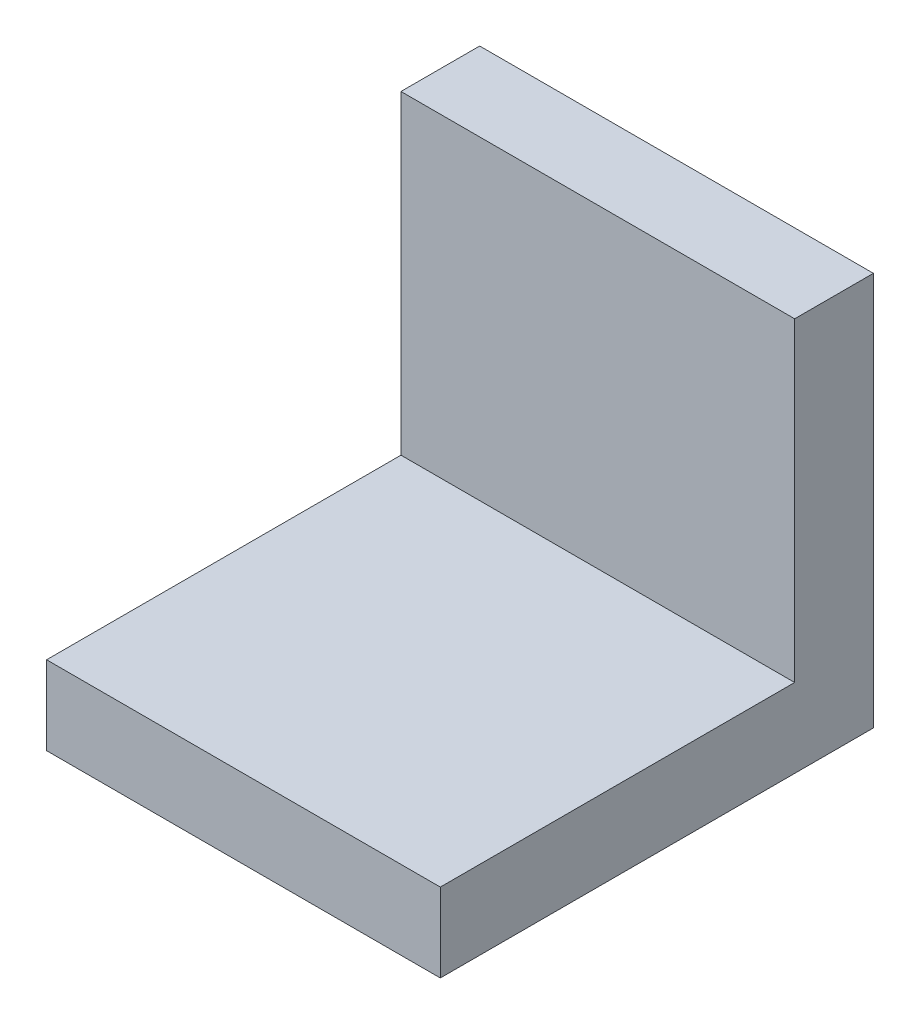
ISO-10303-21;
HEADER;
FILE_DESCRIPTION(('STEP AP214'),'2;1');
FILE_NAME('part.step','',(''),(''),'','','');
FILE_SCHEMA(('AUTOMOTIVE_DESIGN { 1 0 10303 214 1 1 1 1 }'));
ENDSEC;
DATA;
#1=APPLICATION_CONTEXT('core data for automotive mechanical design processes');
#2=APPLICATION_PROTOCOL_DEFINITION('international standard','automotive_design',2000,#1);
#3=PRODUCT_CONTEXT('',#1,'mechanical');
#4=PRODUCT('Part','Part','',(#3));
#5=PRODUCT_RELATED_PRODUCT_CATEGORY('part','',(#4));
#6=PRODUCT_DEFINITION_FORMATION('','',#4);
#7=PRODUCT_DEFINITION_CONTEXT('part definition',#1,'design');
#8=PRODUCT_DEFINITION('design','',#6,#7);
#9=PRODUCT_DEFINITION_SHAPE('','',#8);
#10=(LENGTH_UNIT() NAMED_UNIT(*) SI_UNIT(.MILLI.,.METRE.));
#11=(NAMED_UNIT(*) PLANE_ANGLE_UNIT() SI_UNIT($,.RADIAN.));
#12=(NAMED_UNIT(*) SI_UNIT($,.STERADIAN.) SOLID_ANGLE_UNIT());
#13=UNCERTAINTY_MEASURE_WITH_UNIT(LENGTH_MEASURE(1.E-05),#10,'distance_accuracy_value','');
#14=(GEOMETRIC_REPRESENTATION_CONTEXT(3) GLOBAL_UNCERTAINTY_ASSIGNED_CONTEXT((#13)) GLOBAL_UNIT_ASSIGNED_CONTEXT((#10,
#11,#12)) REPRESENTATION_CONTEXT('',''));
#15=CARTESIAN_POINT('',(0.,0.,0.));
#16=DIRECTION('',(0.,0.,1.));
#17=DIRECTION('',(1.,0.,0.));
#18=AXIS2_PLACEMENT_3D('',#15,#16,#17);
#19=CARTESIAN_POINT('',(25.,0.,-27.5));
#20=DIRECTION('',(0.,0.,1.));
#21=DIRECTION('',(0.,-1.,0.));
#22=AXIS2_PLACEMENT_3D('',#19,#20,#21);
#23=PLANE('',#22);
#24=DIRECTION('',(0.,1.,0.));
#25=VECTOR('',#24,1.);
#26=CARTESIAN_POINT('',(-25.,0.,-27.5));
#27=LINE('',#26,#25);
#28=CARTESIAN_POINT('',(-25.,0.,-27.5));
#29=VERTEX_POINT('',#28);
#30=CARTESIAN_POINT('',(-25.,50.,-27.5));
#31=VERTEX_POINT('',#30);
#32=EDGE_CURVE('E117',#29,#31,#27,.T.);
#33=ORIENTED_EDGE('',*,*,#32,.T.);
#34=DIRECTION('',(-1.,0.,0.));
#35=VECTOR('',#34,1.);
#36=CARTESIAN_POINT('',(25.,50.,-27.5));
#37=LINE('',#36,#35);
#38=CARTESIAN_POINT('',(25.,50.,-27.5));
#39=VERTEX_POINT('',#38);
#40=EDGE_CURVE('E11',#39,#31,#37,.T.);
#41=ORIENTED_EDGE('',*,*,#40,.F.);
#42=DIRECTION('',(0.,1.,0.));
#43=VECTOR('',#42,1.);
#44=CARTESIAN_POINT('',(25.,0.,-27.5));
#45=LINE('',#44,#43);
#46=CARTESIAN_POINT('',(25.,0.,-27.5));
#47=VERTEX_POINT('',#46);
#48=EDGE_CURVE('E127',#47,#39,#45,.T.);
#49=ORIENTED_EDGE('',*,*,#48,.F.);
#50=DIRECTION('',(-1.,0.,0.));
#51=VECTOR('',#50,1.);
#52=CARTESIAN_POINT('',(25.,0.,-27.5));
#53=LINE('',#52,#51);
#54=EDGE_CURVE('E113',#47,#29,#53,.T.);
#55=ORIENTED_EDGE('',*,*,#54,.T.);
#56=EDGE_LOOP('',(#33,#41,#49,#55));
#57=FACE_BOUND('',#56,.T.);
#58=ADVANCED_FACE('F33',(#57),#23,.F.);
#59=CARTESIAN_POINT('',(25.,50.,-27.5));
#60=DIRECTION('',(0.,-1.,0.));
#61=DIRECTION('',(0.,0.,-1.));
#62=AXIS2_PLACEMENT_3D('',#59,#60,#61);
#63=PLANE('',#62);
#64=DIRECTION('',(0.,0.,1.));
#65=VECTOR('',#64,1.);
#66=CARTESIAN_POINT('',(-25.,50.,-27.5));
#67=LINE('',#66,#65);
#68=CARTESIAN_POINT('',(-25.,50.,-17.5));
#69=VERTEX_POINT('',#68);
#70=EDGE_CURVE('E120',#31,#69,#67,.T.);
#71=ORIENTED_EDGE('',*,*,#70,.T.);
#72=DIRECTION('',(-1.,0.,0.));
#73=VECTOR('',#72,1.);
#74=CARTESIAN_POINT('',(25.,50.,-17.5));
#75=LINE('',#74,#73);
#76=CARTESIAN_POINT('',(25.,50.,-17.5));
#77=VERTEX_POINT('',#76);
#78=EDGE_CURVE('E41',#77,#69,#75,.T.);
#79=ORIENTED_EDGE('',*,*,#78,.F.);
#80=DIRECTION('',(0.,0.,1.));
#81=VECTOR('',#80,1.);
#82=CARTESIAN_POINT('',(25.,50.,-27.5));
#83=LINE('',#82,#81);
#84=EDGE_CURVE('E86',#39,#77,#83,.T.);
#85=ORIENTED_EDGE('',*,*,#84,.F.);
#86=ORIENTED_EDGE('',*,*,#40,.T.);
#87=EDGE_LOOP('',(#71,#79,#85,#86));
#88=FACE_BOUND('',#87,.T.);
#89=ADVANCED_FACE('F151',(#88),#63,.F.);
#90=CARTESIAN_POINT('',(25.,50.,-17.5));
#91=DIRECTION('',(0.,0.,-1.));
#92=DIRECTION('',(0.,1.,0.));
#93=AXIS2_PLACEMENT_3D('',#90,#91,#92);
#94=PLANE('',#93);
#95=DIRECTION('',(0.,-1.,0.));
#96=VECTOR('',#95,1.);
#97=CARTESIAN_POINT('',(-25.,50.,-17.5));
#98=LINE('',#97,#96);
#99=CARTESIAN_POINT('',(-25.,9.99999999999999,-17.5));
#100=VERTEX_POINT('',#99);
#101=EDGE_CURVE('E122',#69,#100,#98,.T.);
#102=ORIENTED_EDGE('',*,*,#101,.T.);
#103=DIRECTION('',(-1.,0.,0.));
#104=VECTOR('',#103,1.);
#105=CARTESIAN_POINT('',(25.,9.99999999999999,-17.5));
#106=LINE('',#105,#104);
#107=CARTESIAN_POINT('',(25.,9.99999999999999,-17.5));
#108=VERTEX_POINT('',#107);
#109=EDGE_CURVE('E108',#108,#100,#106,.T.);
#110=ORIENTED_EDGE('',*,*,#109,.F.);
#111=DIRECTION('',(0.,-1.,0.));
#112=VECTOR('',#111,1.);
#113=CARTESIAN_POINT('',(25.,50.,-17.5));
#114=LINE('',#113,#112);
#115=EDGE_CURVE('E99',#77,#108,#114,.T.);
#116=ORIENTED_EDGE('',*,*,#115,.F.);
#117=ORIENTED_EDGE('',*,*,#78,.T.);
#118=EDGE_LOOP('',(#102,#110,#116,#117));
#119=FACE_BOUND('',#118,.T.);
#120=ADVANCED_FACE('F133',(#119),#94,.F.);
#121=CARTESIAN_POINT('',(25.,9.99999999999999,-17.5));
#122=DIRECTION('',(0.,-1.,0.));
#123=DIRECTION('',(0.,0.,-1.));
#124=AXIS2_PLACEMENT_3D('',#121,#122,#123);
#125=PLANE('',#124);
#126=DIRECTION('',(0.,0.,1.));
#127=VECTOR('',#126,1.);
#128=CARTESIAN_POINT('',(-25.,9.99999999999999,-17.5));
#129=LINE('',#128,#127);
#130=CARTESIAN_POINT('',(-25.,10.,27.5));
#131=VERTEX_POINT('',#130);
#132=EDGE_CURVE('E107',#100,#131,#129,.T.);
#133=ORIENTED_EDGE('',*,*,#132,.T.);
#134=DIRECTION('',(-1.,0.,0.));
#135=VECTOR('',#134,1.);
#136=CARTESIAN_POINT('',(25.,10.,27.5));
#137=LINE('',#136,#135);
#138=CARTESIAN_POINT('',(25.,10.,27.5));
#139=VERTEX_POINT('',#138);
#140=EDGE_CURVE('E104',#139,#131,#137,.T.);
#141=ORIENTED_EDGE('',*,*,#140,.F.);
#142=DIRECTION('',(0.,0.,1.));
#143=VECTOR('',#142,1.);
#144=CARTESIAN_POINT('',(25.,9.99999999999999,-17.5));
#145=LINE('',#144,#143);
#146=EDGE_CURVE('E93',#108,#139,#145,.T.);
#147=ORIENTED_EDGE('',*,*,#146,.F.);
#148=ORIENTED_EDGE('',*,*,#109,.T.);
#149=EDGE_LOOP('',(#133,#141,#147,#148));
#150=FACE_BOUND('',#149,.T.);
#151=ADVANCED_FACE('F105',(#150),#125,.F.);
#152=CARTESIAN_POINT('',(25.,10.,27.5));
#153=DIRECTION('',(0.,0.,-1.));
#154=DIRECTION('',(0.,1.,0.));
#155=AXIS2_PLACEMENT_3D('',#152,#153,#154);
#156=PLANE('',#155);
#157=DIRECTION('',(0.,-1.,0.));
#158=VECTOR('',#157,1.);
#159=CARTESIAN_POINT('',(-25.,10.,27.5));
#160=LINE('',#159,#158);
#161=CARTESIAN_POINT('',(-25.,0.,27.5));
#162=VERTEX_POINT('',#161);
#163=EDGE_CURVE('E72',#131,#162,#160,.T.);
#164=ORIENTED_EDGE('',*,*,#163,.T.);
#165=DIRECTION('',(-1.,0.,0.));
#166=VECTOR('',#165,1.);
#167=CARTESIAN_POINT('',(25.,0.,27.5));
#168=LINE('',#167,#166);
#169=CARTESIAN_POINT('',(25.,0.,27.5));
#170=VERTEX_POINT('',#169);
#171=EDGE_CURVE('E109',#170,#162,#168,.T.);
#172=ORIENTED_EDGE('',*,*,#171,.F.);
#173=DIRECTION('',(0.,-1.,0.));
#174=VECTOR('',#173,1.);
#175=CARTESIAN_POINT('',(25.,10.,27.5));
#176=LINE('',#175,#174);
#177=EDGE_CURVE('E97',#139,#170,#176,.T.);
#178=ORIENTED_EDGE('',*,*,#177,.F.);
#179=ORIENTED_EDGE('',*,*,#140,.T.);
#180=EDGE_LOOP('',(#164,#172,#178,#179));
#181=FACE_BOUND('',#180,.T.);
#182=ADVANCED_FACE('F111',(#181),#156,.F.);
#183=CARTESIAN_POINT('',(25.,0.,27.5));
#184=DIRECTION('',(0.,1.,0.));
#185=DIRECTION('',(0.,0.,1.));
#186=AXIS2_PLACEMENT_3D('',#183,#184,#185);
#187=PLANE('',#186);
#188=DIRECTION('',(0.,0.,-1.));
#189=VECTOR('',#188,1.);
#190=CARTESIAN_POINT('',(-25.,0.,27.5));
#191=LINE('',#190,#189);
#192=EDGE_CURVE('E78',#162,#29,#191,.T.);
#193=ORIENTED_EDGE('',*,*,#192,.T.);
#194=ORIENTED_EDGE('',*,*,#54,.F.);
#195=DIRECTION('',(0.,0.,-1.));
#196=VECTOR('',#195,1.);
#197=CARTESIAN_POINT('',(25.,0.,27.5));
#198=LINE('',#197,#196);
#199=EDGE_CURVE('E49',#170,#47,#198,.T.);
#200=ORIENTED_EDGE('',*,*,#199,.F.);
#201=ORIENTED_EDGE('',*,*,#171,.T.);
#202=EDGE_LOOP('',(#193,#194,#200,#201));
#203=FACE_BOUND('',#202,.T.);
#204=ADVANCED_FACE('F140',(#203),#187,.F.);
#205=CARTESIAN_POINT('',(25.,0.,0.));
#206=DIRECTION('',(1.,0.,0.));
#207=DIRECTION('',(0.,0.,-1.));
#208=AXIS2_PLACEMENT_3D('',#205,#206,#207);
#209=PLANE('',#208);
#210=ORIENTED_EDGE('',*,*,#48,.T.);
#211=ORIENTED_EDGE('',*,*,#84,.T.);
#212=ORIENTED_EDGE('',*,*,#115,.T.);
#213=ORIENTED_EDGE('',*,*,#146,.T.);
#214=ORIENTED_EDGE('',*,*,#177,.T.);
#215=ORIENTED_EDGE('',*,*,#199,.T.);
#216=EDGE_LOOP('',(#210,#211,#212,#213,#214,#215));
#217=FACE_BOUND('',#216,.T.);
#218=ADVANCED_FACE('F95',(#217),#209,.T.);
#219=CARTESIAN_POINT('',(-25.,0.,0.));
#220=DIRECTION('',(1.,0.,0.));
#221=DIRECTION('',(0.,0.,-1.));
#222=AXIS2_PLACEMENT_3D('',#219,#220,#221);
#223=PLANE('',#222);
#224=ORIENTED_EDGE('',*,*,#32,.F.);
#225=ORIENTED_EDGE('',*,*,#192,.F.);
#226=ORIENTED_EDGE('',*,*,#163,.F.);
#227=ORIENTED_EDGE('',*,*,#132,.F.);
#228=ORIENTED_EDGE('',*,*,#101,.F.);
#229=ORIENTED_EDGE('',*,*,#70,.F.);
#230=EDGE_LOOP('',(#224,#225,#226,#227,#228,#229));
#231=FACE_BOUND('',#230,.T.);
#232=ADVANCED_FACE('F136',(#231),#223,.F.);
#233=CLOSED_SHELL('',(#58,#89,#120,#151,#182,#204,#218,#232));
#234=MANIFOLD_SOLID_BREP('B2',#233);
#235=ADVANCED_BREP_SHAPE_REPRESENTATION('',(#18,#234),#14);
#236=SHAPE_DEFINITION_REPRESENTATION(#9,#235);
ENDSEC;
END-ISO-10303-21;
